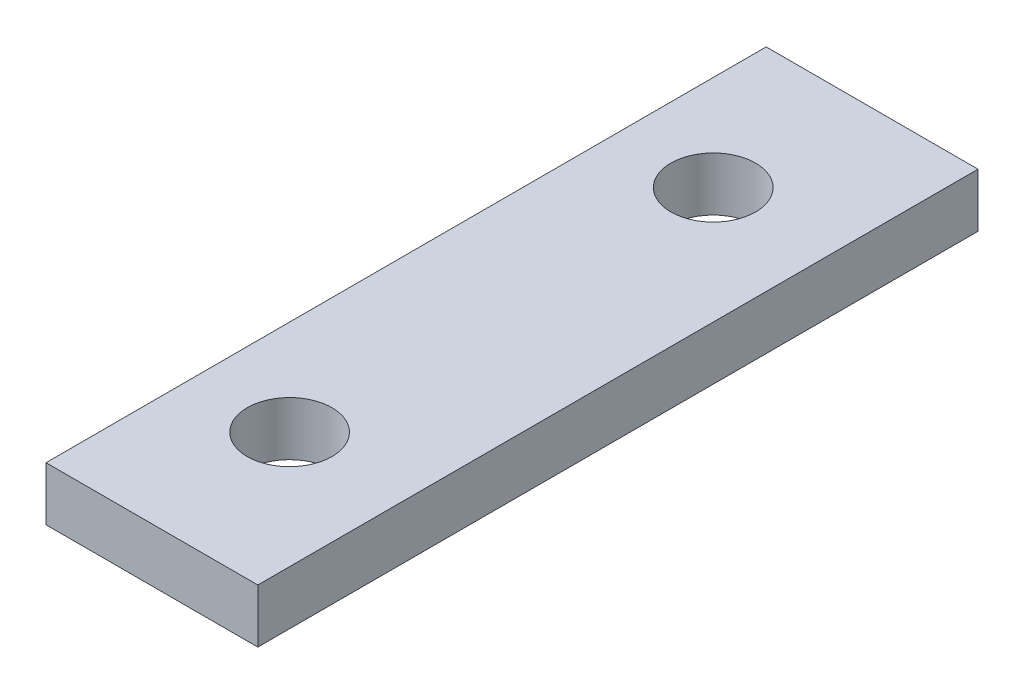
ISO-10303-21;
HEADER;
FILE_DESCRIPTION(('STEP AP214'),'2;1');
FILE_NAME('part.step','',(''),(''),'','','');
FILE_SCHEMA(('AUTOMOTIVE_DESIGN { 1 0 10303 214 1 1 1 1 }'));
ENDSEC;
DATA;
#1=APPLICATION_CONTEXT('core data for automotive mechanical design processes');
#2=APPLICATION_PROTOCOL_DEFINITION('international standard','automotive_design',2000,#1);
#3=PRODUCT_CONTEXT('',#1,'mechanical');
#4=PRODUCT('Part','Part','',(#3));
#5=PRODUCT_RELATED_PRODUCT_CATEGORY('part','',(#4));
#6=PRODUCT_DEFINITION_FORMATION('','',#4);
#7=PRODUCT_DEFINITION_CONTEXT('part definition',#1,'design');
#8=PRODUCT_DEFINITION('design','',#6,#7);
#9=PRODUCT_DEFINITION_SHAPE('','',#8);
#10=(LENGTH_UNIT() NAMED_UNIT(*) SI_UNIT(.MILLI.,.METRE.));
#11=(NAMED_UNIT(*) PLANE_ANGLE_UNIT() SI_UNIT($,.RADIAN.));
#12=(NAMED_UNIT(*) SI_UNIT($,.STERADIAN.) SOLID_ANGLE_UNIT());
#13=UNCERTAINTY_MEASURE_WITH_UNIT(LENGTH_MEASURE(1.E-05),#10,'distance_accuracy_value','');
#14=(GEOMETRIC_REPRESENTATION_CONTEXT(3) GLOBAL_UNCERTAINTY_ASSIGNED_CONTEXT((#13)) GLOBAL_UNIT_ASSIGNED_CONTEXT((#10,
#11,#12)) REPRESENTATION_CONTEXT('',''));
#15=CARTESIAN_POINT('',(0.,0.,0.));
#16=DIRECTION('',(0.,0.,1.));
#17=DIRECTION('',(1.,0.,0.));
#18=AXIS2_PLACEMENT_3D('',#15,#16,#17);
#19=CARTESIAN_POINT('',(0.,12.7,0.));
#20=DIRECTION('',(0.,-1.,0.));
#21=DIRECTION('',(0.,0.,-1.));
#22=AXIS2_PLACEMENT_3D('',#19,#20,#21);
#23=PLANE('',#22);
#24=DIRECTION('',(0.,0.,-1.));
#25=VECTOR('',#24,1.);
#26=CARTESIAN_POINT('',(25.,12.7,85.));
#27=LINE('',#26,#25);
#28=CARTESIAN_POINT('',(25.,12.7,85.));
#29=VERTEX_POINT('',#28);
#30=CARTESIAN_POINT('',(25.,12.7,-85.));
#31=VERTEX_POINT('',#30);
#32=EDGE_CURVE('E85',#29,#31,#27,.T.);
#33=ORIENTED_EDGE('',*,*,#32,.T.);
#34=DIRECTION('',(-1.,0.,0.));
#35=VECTOR('',#34,1.);
#36=CARTESIAN_POINT('',(-25.,12.7,-85.));
#37=LINE('',#36,#35);
#38=CARTESIAN_POINT('',(-25.,12.7,-85.));
#39=VERTEX_POINT('',#38);
#40=EDGE_CURVE('E80',#31,#39,#37,.T.);
#41=ORIENTED_EDGE('',*,*,#40,.T.);
#42=DIRECTION('',(0.,0.,1.));
#43=VECTOR('',#42,1.);
#44=CARTESIAN_POINT('',(-25.,12.7,85.));
#45=LINE('',#44,#43);
#46=CARTESIAN_POINT('',(-25.,12.7,85.));
#47=VERTEX_POINT('',#46);
#48=EDGE_CURVE('E83',#39,#47,#45,.T.);
#49=ORIENTED_EDGE('',*,*,#48,.T.);
#50=DIRECTION('',(1.,0.,0.));
#51=VECTOR('',#50,1.);
#52=CARTESIAN_POINT('',(-25.,12.7,85.));
#53=LINE('',#52,#51);
#54=EDGE_CURVE('E50',#47,#29,#53,.T.);
#55=ORIENTED_EDGE('',*,*,#54,.T.);
#56=EDGE_LOOP('',(#33,#41,#49,#55));
#57=FACE_BOUND('',#56,.T.);
#58=CARTESIAN_POINT('',(-2.49999999999999,12.7,-50.));
#59=DIRECTION('',(0.,1.,0.));
#60=DIRECTION('',(0.,0.,1.));
#61=AXIS2_PLACEMENT_3D('',#58,#59,#60);
#62=CIRCLE('',#61,10.);
#63=CARTESIAN_POINT('',(-2.49999999999999,12.7,-40.));
#64=VERTEX_POINT('',#63);
#65=EDGE_CURVE('E100',#64,#64,#62,.T.);
#66=ORIENTED_EDGE('',*,*,#65,.F.);
#67=EDGE_LOOP('',(#66));
#68=FACE_BOUND('',#67,.T.);
#69=CARTESIAN_POINT('',(-2.49999999999997,12.7,50.));
#70=DIRECTION('',(0.,1.,0.));
#71=DIRECTION('',(0.,0.,1.));
#72=AXIS2_PLACEMENT_3D('',#69,#70,#71);
#73=CIRCLE('',#72,10.);
#74=CARTESIAN_POINT('',(-2.49999999999997,12.7,60.));
#75=VERTEX_POINT('',#74);
#76=EDGE_CURVE('E115',#75,#75,#73,.T.);
#77=ORIENTED_EDGE('',*,*,#76,.F.);
#78=EDGE_LOOP('',(#77));
#79=FACE_BOUND('',#78,.T.);
#80=ADVANCED_FACE('F33',(#57,#68,#79),#23,.F.);
#81=CARTESIAN_POINT('',(0.,0.,0.));
#82=DIRECTION('',(0.,-1.,0.));
#83=DIRECTION('',(0.,0.,-1.));
#84=AXIS2_PLACEMENT_3D('',#81,#82,#83);
#85=PLANE('',#84);
#86=CARTESIAN_POINT('',(-2.49999999999999,0.,-50.));
#87=DIRECTION('',(0.,1.,0.));
#88=DIRECTION('',(0.,0.,1.));
#89=AXIS2_PLACEMENT_3D('',#86,#87,#88);
#90=CIRCLE('',#89,10.);
#91=CARTESIAN_POINT('',(-2.49999999999999,0.,-40.));
#92=VERTEX_POINT('',#91);
#93=EDGE_CURVE('E112',#92,#92,#90,.T.);
#94=ORIENTED_EDGE('',*,*,#93,.T.);
#95=EDGE_LOOP('',(#94));
#96=FACE_BOUND('',#95,.T.);
#97=DIRECTION('',(0.,0.,-1.));
#98=VECTOR('',#97,1.);
#99=CARTESIAN_POINT('',(25.,0.,85.));
#100=LINE('',#99,#98);
#101=CARTESIAN_POINT('',(25.,0.,85.));
#102=VERTEX_POINT('',#101);
#103=CARTESIAN_POINT('',(25.,0.,-85.));
#104=VERTEX_POINT('',#103);
#105=EDGE_CURVE('E97',#102,#104,#100,.T.);
#106=ORIENTED_EDGE('',*,*,#105,.F.);
#107=DIRECTION('',(1.,0.,0.));
#108=VECTOR('',#107,1.);
#109=CARTESIAN_POINT('',(-25.,0.,85.));
#110=LINE('',#109,#108);
#111=CARTESIAN_POINT('',(-25.,0.,85.));
#112=VERTEX_POINT('',#111);
#113=EDGE_CURVE('E73',#112,#102,#110,.T.);
#114=ORIENTED_EDGE('',*,*,#113,.F.);
#115=DIRECTION('',(0.,0.,1.));
#116=VECTOR('',#115,1.);
#117=CARTESIAN_POINT('',(-25.,0.,85.));
#118=LINE('',#117,#116);
#119=CARTESIAN_POINT('',(-25.,0.,-85.));
#120=VERTEX_POINT('',#119);
#121=EDGE_CURVE('E67',#120,#112,#118,.T.);
#122=ORIENTED_EDGE('',*,*,#121,.F.);
#123=DIRECTION('',(-1.,0.,0.));
#124=VECTOR('',#123,1.);
#125=CARTESIAN_POINT('',(-25.,0.,-85.));
#126=LINE('',#125,#124);
#127=EDGE_CURVE('E89',#104,#120,#126,.T.);
#128=ORIENTED_EDGE('',*,*,#127,.F.);
#129=EDGE_LOOP('',(#106,#114,#122,#128));
#130=FACE_BOUND('',#129,.T.);
#131=CARTESIAN_POINT('',(-2.49999999999997,0.,50.));
#132=DIRECTION('',(0.,1.,0.));
#133=DIRECTION('',(0.,0.,1.));
#134=AXIS2_PLACEMENT_3D('',#131,#132,#133);
#135=CIRCLE('',#134,10.);
#136=CARTESIAN_POINT('',(-2.49999999999997,0.,60.));
#137=VERTEX_POINT('',#136);
#138=EDGE_CURVE('E118',#137,#137,#135,.T.);
#139=ORIENTED_EDGE('',*,*,#138,.T.);
#140=EDGE_LOOP('',(#139));
#141=FACE_BOUND('',#140,.T.);
#142=ADVANCED_FACE('F108',(#96,#130,#141),#85,.T.);
#143=CARTESIAN_POINT('',(25.,12.7,85.));
#144=DIRECTION('',(-1.,0.,0.));
#145=DIRECTION('',(0.,0.,1.));
#146=AXIS2_PLACEMENT_3D('',#143,#144,#145);
#147=PLANE('',#146);
#148=ORIENTED_EDGE('',*,*,#105,.T.);
#149=DIRECTION('',(0.,-1.,0.));
#150=VECTOR('',#149,1.);
#151=CARTESIAN_POINT('',(25.,12.7,-85.));
#152=LINE('',#151,#150);
#153=EDGE_CURVE('E11',#31,#104,#152,.T.);
#154=ORIENTED_EDGE('',*,*,#153,.F.);
#155=ORIENTED_EDGE('',*,*,#32,.F.);
#156=DIRECTION('',(0.,-1.,0.));
#157=VECTOR('',#156,1.);
#158=CARTESIAN_POINT('',(25.,12.7,85.));
#159=LINE('',#158,#157);
#160=EDGE_CURVE('E93',#29,#102,#159,.T.);
#161=ORIENTED_EDGE('',*,*,#160,.T.);
#162=EDGE_LOOP('',(#148,#154,#155,#161));
#163=FACE_BOUND('',#162,.T.);
#164=ADVANCED_FACE('F35',(#163),#147,.F.);
#165=CARTESIAN_POINT('',(-25.,12.7,-85.));
#166=DIRECTION('',(0.,0.,1.));
#167=DIRECTION('',(1.,0.,0.));
#168=AXIS2_PLACEMENT_3D('',#165,#166,#167);
#169=PLANE('',#168);
#170=ORIENTED_EDGE('',*,*,#127,.T.);
#171=DIRECTION('',(0.,-1.,0.));
#172=VECTOR('',#171,1.);
#173=CARTESIAN_POINT('',(-25.,12.7,-85.));
#174=LINE('',#173,#172);
#175=EDGE_CURVE('E42',#39,#120,#174,.T.);
#176=ORIENTED_EDGE('',*,*,#175,.F.);
#177=ORIENTED_EDGE('',*,*,#40,.F.);
#178=ORIENTED_EDGE('',*,*,#153,.T.);
#179=EDGE_LOOP('',(#170,#176,#177,#178));
#180=FACE_BOUND('',#179,.T.);
#181=ADVANCED_FACE('F88',(#180),#169,.F.);
#182=CARTESIAN_POINT('',(-25.,12.7,85.));
#183=DIRECTION('',(1.,0.,0.));
#184=DIRECTION('',(0.,0.,-1.));
#185=AXIS2_PLACEMENT_3D('',#182,#183,#184);
#186=PLANE('',#185);
#187=ORIENTED_EDGE('',*,*,#121,.T.);
#188=DIRECTION('',(0.,-1.,0.));
#189=VECTOR('',#188,1.);
#190=CARTESIAN_POINT('',(-25.,12.7,85.));
#191=LINE('',#190,#189);
#192=EDGE_CURVE('E90',#47,#112,#191,.T.);
#193=ORIENTED_EDGE('',*,*,#192,.F.);
#194=ORIENTED_EDGE('',*,*,#48,.F.);
#195=ORIENTED_EDGE('',*,*,#175,.T.);
#196=EDGE_LOOP('',(#187,#193,#194,#195));
#197=FACE_BOUND('',#196,.T.);
#198=ADVANCED_FACE('F91',(#197),#186,.F.);
#199=CARTESIAN_POINT('',(-25.,12.7,85.));
#200=DIRECTION('',(0.,0.,-1.));
#201=DIRECTION('',(-1.,0.,0.));
#202=AXIS2_PLACEMENT_3D('',#199,#200,#201);
#203=PLANE('',#202);
#204=ORIENTED_EDGE('',*,*,#113,.T.);
#205=ORIENTED_EDGE('',*,*,#160,.F.);
#206=ORIENTED_EDGE('',*,*,#54,.F.);
#207=ORIENTED_EDGE('',*,*,#192,.T.);
#208=EDGE_LOOP('',(#204,#205,#206,#207));
#209=FACE_BOUND('',#208,.T.);
#210=ADVANCED_FACE('F105',(#209),#203,.F.);
#211=CARTESIAN_POINT('',(-2.49999999999999,12.7,-50.));
#212=DIRECTION('',(0.,-1.,0.));
#213=DIRECTION('',(0.,0.,-1.));
#214=AXIS2_PLACEMENT_3D('',#211,#212,#213);
#215=CYLINDRICAL_SURFACE('',#214,10.);
#216=ORIENTED_EDGE('',*,*,#65,.T.);
#217=EDGE_LOOP('',(#216));
#218=FACE_BOUND('',#217,.T.);
#219=ORIENTED_EDGE('',*,*,#93,.F.);
#220=EDGE_LOOP('',(#219));
#221=FACE_BOUND('',#220,.T.);
#222=ADVANCED_FACE('F135',(#218,#221),#215,.F.);
#223=CARTESIAN_POINT('',(-2.49999999999997,12.7,50.));
#224=DIRECTION('',(0.,-1.,0.));
#225=DIRECTION('',(0.,0.,-1.));
#226=AXIS2_PLACEMENT_3D('',#223,#224,#225);
#227=CYLINDRICAL_SURFACE('',#226,10.);
#228=ORIENTED_EDGE('',*,*,#76,.T.);
#229=EDGE_LOOP('',(#228));
#230=FACE_BOUND('',#229,.T.);
#231=ORIENTED_EDGE('',*,*,#138,.F.);
#232=EDGE_LOOP('',(#231));
#233=FACE_BOUND('',#232,.T.);
#234=ADVANCED_FACE('F124',(#230,#233),#227,.F.);
#235=CLOSED_SHELL('',(#80,#142,#164,#181,#198,#210,#222,#234));
#236=MANIFOLD_SOLID_BREP('B2',#235);
#237=ADVANCED_BREP_SHAPE_REPRESENTATION('',(#18,#236),#14);
#238=SHAPE_DEFINITION_REPRESENTATION(#9,#237);
ENDSEC;
END-ISO-10303-21;
